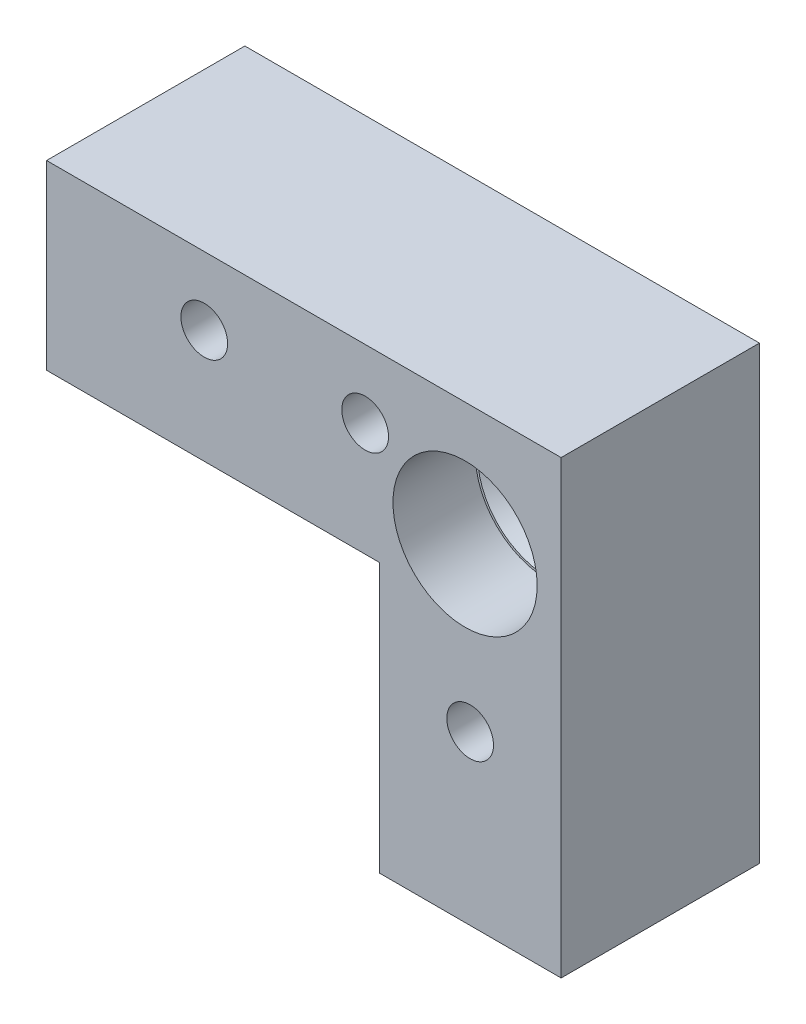
ISO-10303-21;
HEADER;
FILE_DESCRIPTION(('STEP AP214'),'2;1');
FILE_NAME('part.step','',(''),(''),'','','');
FILE_SCHEMA(('AUTOMOTIVE_DESIGN { 1 0 10303 214 1 1 1 1 }'));
ENDSEC;
DATA;
#1=APPLICATION_CONTEXT('core data for automotive mechanical design processes');
#2=APPLICATION_PROTOCOL_DEFINITION('international standard','automotive_design',2000,#1);
#3=PRODUCT_CONTEXT('',#1,'mechanical');
#4=PRODUCT('Part','Part','',(#3));
#5=PRODUCT_RELATED_PRODUCT_CATEGORY('part','',(#4));
#6=PRODUCT_DEFINITION_FORMATION('','',#4);
#7=PRODUCT_DEFINITION_CONTEXT('part definition',#1,'design');
#8=PRODUCT_DEFINITION('design','',#6,#7);
#9=PRODUCT_DEFINITION_SHAPE('','',#8);
#10=(LENGTH_UNIT() NAMED_UNIT(*) SI_UNIT(.MILLI.,.METRE.));
#11=(NAMED_UNIT(*) PLANE_ANGLE_UNIT() SI_UNIT($,.RADIAN.));
#12=(NAMED_UNIT(*) SI_UNIT($,.STERADIAN.) SOLID_ANGLE_UNIT());
#13=UNCERTAINTY_MEASURE_WITH_UNIT(LENGTH_MEASURE(1.E-05),#10,'distance_accuracy_value','');
#14=(GEOMETRIC_REPRESENTATION_CONTEXT(3) GLOBAL_UNCERTAINTY_ASSIGNED_CONTEXT((#13)) GLOBAL_UNIT_ASSIGNED_CONTEXT((#10,
#11,#12)) REPRESENTATION_CONTEXT('',''));
#15=CARTESIAN_POINT('',(0.,0.,0.));
#16=DIRECTION('',(0.,0.,1.));
#17=DIRECTION('',(1.,0.,0.));
#18=AXIS2_PLACEMENT_3D('',#15,#16,#17);
#19=CARTESIAN_POINT('',(-1.10000000000001,-5.25,-10.));
#20=DIRECTION('',(0.,0.,1.));
#21=DIRECTION('',(1.,0.,0.));
#22=AXIS2_PLACEMENT_3D('',#19,#20,#21);
#23=CYLINDRICAL_SURFACE('',#22,1.825);
#24=CARTESIAN_POINT('',(-1.10000000000001,-5.25,0.));
#25=DIRECTION('',(0.,0.,-1.));
#26=DIRECTION('',(-1.,0.,0.));
#27=AXIS2_PLACEMENT_3D('',#24,#25,#26);
#28=CIRCLE('',#27,1.825);
#29=CARTESIAN_POINT('',(-2.92500000000001,-5.25,0.));
#30=VERTEX_POINT('',#29);
#31=EDGE_CURVE('E127',#30,#30,#28,.T.);
#32=ORIENTED_EDGE('',*,*,#31,.F.);
#33=EDGE_LOOP('',(#32));
#34=FACE_BOUND('',#33,.T.);
#35=CARTESIAN_POINT('',(-1.10000000000001,-5.25,-5.));
#36=DIRECTION('',(0.,0.,-1.));
#37=DIRECTION('',(-1.,0.,0.));
#38=AXIS2_PLACEMENT_3D('',#35,#36,#37);
#39=CIRCLE('',#38,1.825);
#40=CARTESIAN_POINT('',(-2.92500000000001,-5.25,-5.));
#41=VERTEX_POINT('',#40);
#42=EDGE_CURVE('E209',#41,#41,#39,.T.);
#43=ORIENTED_EDGE('',*,*,#42,.T.);
#44=EDGE_LOOP('',(#43));
#45=FACE_BOUND('',#44,.T.);
#46=ADVANCED_FACE('F45',(#34,#45),#23,.F.);
#47=CARTESIAN_POINT('',(-13.5,-5.25,-10.));
#48=DIRECTION('',(0.,0.,1.));
#49=DIRECTION('',(1.,0.,0.));
#50=AXIS2_PLACEMENT_3D('',#47,#48,#49);
#51=CYLINDRICAL_SURFACE('',#50,1.825);
#52=CARTESIAN_POINT('',(-13.5,-5.25,0.));
#53=DIRECTION('',(0.,0.,-1.));
#54=DIRECTION('',(-1.,0.,0.));
#55=AXIS2_PLACEMENT_3D('',#52,#53,#54);
#56=CIRCLE('',#55,1.825);
#57=CARTESIAN_POINT('',(-15.325,-5.25,0.));
#58=VERTEX_POINT('',#57);
#59=EDGE_CURVE('E131',#58,#58,#56,.T.);
#60=ORIENTED_EDGE('',*,*,#59,.F.);
#61=EDGE_LOOP('',(#60));
#62=FACE_BOUND('',#61,.T.);
#63=CARTESIAN_POINT('',(-13.5,-5.25,-5.));
#64=DIRECTION('',(0.,0.,-1.));
#65=DIRECTION('',(-1.,0.,0.));
#66=AXIS2_PLACEMENT_3D('',#63,#64,#65);
#67=CIRCLE('',#66,1.825);
#68=CARTESIAN_POINT('',(-15.325,-5.25,-5.));
#69=VERTEX_POINT('',#68);
#70=EDGE_CURVE('E204',#69,#69,#67,.T.);
#71=ORIENTED_EDGE('',*,*,#70,.T.);
#72=EDGE_LOOP('',(#71));
#73=FACE_BOUND('',#72,.T.);
#74=ADVANCED_FACE('F231',(#62,#73),#51,.F.);
#75=CARTESIAN_POINT('',(6.98999999999999,-21.8,-10.));
#76=DIRECTION('',(0.,0.,1.));
#77=DIRECTION('',(1.,0.,0.));
#78=AXIS2_PLACEMENT_3D('',#75,#76,#77);
#79=CYLINDRICAL_SURFACE('',#78,1.825);
#80=CARTESIAN_POINT('',(6.98999999999999,-21.8,0.));
#81=DIRECTION('',(0.,0.,-1.));
#82=DIRECTION('',(-1.,0.,0.));
#83=AXIS2_PLACEMENT_3D('',#80,#81,#82);
#84=CIRCLE('',#83,1.825);
#85=CARTESIAN_POINT('',(5.16499999999999,-21.8,0.));
#86=VERTEX_POINT('',#85);
#87=EDGE_CURVE('E370',#86,#86,#84,.T.);
#88=ORIENTED_EDGE('',*,*,#87,.F.);
#89=EDGE_LOOP('',(#88));
#90=FACE_BOUND('',#89,.T.);
#91=CARTESIAN_POINT('',(6.98999999999999,-21.8,-5.));
#92=DIRECTION('',(0.,0.,-1.));
#93=DIRECTION('',(-1.,0.,0.));
#94=AXIS2_PLACEMENT_3D('',#91,#92,#93);
#95=CIRCLE('',#94,1.825);
#96=CARTESIAN_POINT('',(5.16499999999999,-21.8,-5.));
#97=VERTEX_POINT('',#96);
#98=EDGE_CURVE('E200',#97,#97,#95,.T.);
#99=ORIENTED_EDGE('',*,*,#98,.T.);
#100=EDGE_LOOP('',(#99));
#101=FACE_BOUND('',#100,.T.);
#102=ADVANCED_FACE('F237',(#90,#101),#79,.F.);
#103=CARTESIAN_POINT('',(0.,0.,42.65));
#104=DIRECTION('',(0.,-1.,0.));
#105=DIRECTION('',(1.,0.,0.));
#106=AXIS2_PLACEMENT_3D('',#103,#104,#105);
#107=PLANE('',#106);
#108=DIRECTION('',(0.,0.,-1.));
#109=VECTOR('',#108,1.);
#110=CARTESIAN_POINT('',(-25.65,0.,42.65));
#111=LINE('',#110,#109);
#112=CARTESIAN_POINT('',(-25.65,0.,5.28));
#113=VERTEX_POINT('',#112);
#114=CARTESIAN_POINT('',(-25.65,0.,-10.));
#115=VERTEX_POINT('',#114);
#116=EDGE_CURVE('E99',#113,#115,#111,.T.);
#117=ORIENTED_EDGE('',*,*,#116,.F.);
#118=DIRECTION('',(-1.,0.,0.));
#119=VECTOR('',#118,1.);
#120=CARTESIAN_POINT('',(-36.4186276215853,0.,5.28));
#121=LINE('',#120,#119);
#122=CARTESIAN_POINT('',(14.,0.,5.28));
#123=VERTEX_POINT('',#122);
#124=EDGE_CURVE('E146',#123,#113,#121,.T.);
#125=ORIENTED_EDGE('',*,*,#124,.F.);
#126=DIRECTION('',(0.,0.,-1.));
#127=VECTOR('',#126,1.);
#128=CARTESIAN_POINT('',(14.,0.,42.65));
#129=LINE('',#128,#127);
#130=CARTESIAN_POINT('',(14.,0.,-10.));
#131=VERTEX_POINT('',#130);
#132=EDGE_CURVE('E114',#123,#131,#129,.T.);
#133=ORIENTED_EDGE('',*,*,#132,.T.);
#134=DIRECTION('',(1.,0.,0.));
#135=VECTOR('',#134,1.);
#136=CARTESIAN_POINT('',(-25.65,0.,-10.));
#137=LINE('',#136,#135);
#138=EDGE_CURVE('E111',#115,#131,#137,.T.);
#139=ORIENTED_EDGE('',*,*,#138,.F.);
#140=EDGE_LOOP('',(#117,#125,#133,#139));
#141=FACE_BOUND('',#140,.T.);
#142=ADVANCED_FACE('F112',(#141),#107,.F.);
#143=CARTESIAN_POINT('',(-25.65,0.,42.65));
#144=DIRECTION('',(1.,0.,0.));
#145=DIRECTION('',(0.,1.,0.));
#146=AXIS2_PLACEMENT_3D('',#143,#144,#145);
#147=PLANE('',#146);
#148=DIRECTION('',(0.,0.,-1.));
#149=VECTOR('',#148,1.);
#150=CARTESIAN_POINT('',(-25.65,-14.,42.65));
#151=LINE('',#150,#149);
#152=CARTESIAN_POINT('',(-25.65,-14.,5.28));
#153=VERTEX_POINT('',#152);
#154=CARTESIAN_POINT('',(-25.65,-14.,-10.));
#155=VERTEX_POINT('',#154);
#156=EDGE_CURVE('E108',#153,#155,#151,.T.);
#157=ORIENTED_EDGE('',*,*,#156,.F.);
#158=DIRECTION('',(0.,1.,0.));
#159=VECTOR('',#158,1.);
#160=CARTESIAN_POINT('',(-25.65,0.,5.28));
#161=LINE('',#160,#159);
#162=EDGE_CURVE('E69',#153,#113,#161,.T.);
#163=ORIENTED_EDGE('',*,*,#162,.T.);
#164=ORIENTED_EDGE('',*,*,#116,.T.);
#165=DIRECTION('',(0.,1.,0.));
#166=VECTOR('',#165,1.);
#167=CARTESIAN_POINT('',(-25.65,-14.,-10.));
#168=LINE('',#167,#166);
#169=EDGE_CURVE('E104',#155,#115,#168,.T.);
#170=ORIENTED_EDGE('',*,*,#169,.F.);
#171=EDGE_LOOP('',(#157,#163,#164,#170));
#172=FACE_BOUND('',#171,.T.);
#173=ADVANCED_FACE('F102',(#172),#147,.F.);
#174=CARTESIAN_POINT('',(0.,-14.,42.65));
#175=DIRECTION('',(0.,-1.,0.));
#176=DIRECTION('',(1.,0.,0.));
#177=AXIS2_PLACEMENT_3D('',#174,#175,#176);
#178=PLANE('',#177);
#179=DIRECTION('',(1.,0.,0.));
#180=VECTOR('',#179,1.);
#181=CARTESIAN_POINT('',(0.,-14.,5.28));
#182=LINE('',#181,#180);
#183=CARTESIAN_POINT('',(0.,-14.,5.28));
#184=VERTEX_POINT('',#183);
#185=EDGE_CURVE('E167',#153,#184,#182,.T.);
#186=ORIENTED_EDGE('',*,*,#185,.F.);
#187=ORIENTED_EDGE('',*,*,#156,.T.);
#188=DIRECTION('',(-1.,0.,0.));
#189=VECTOR('',#188,1.);
#190=CARTESIAN_POINT('',(0.,-14.,-10.));
#191=LINE('',#190,#189);
#192=CARTESIAN_POINT('',(0.,-14.,-10.));
#193=VERTEX_POINT('',#192);
#194=EDGE_CURVE('E125',#193,#155,#191,.T.);
#195=ORIENTED_EDGE('',*,*,#194,.F.);
#196=DIRECTION('',(0.,0.,-1.));
#197=VECTOR('',#196,1.);
#198=CARTESIAN_POINT('',(0.,-14.,42.65));
#199=LINE('',#198,#197);
#200=EDGE_CURVE('E192',#184,#193,#199,.T.);
#201=ORIENTED_EDGE('',*,*,#200,.F.);
#202=EDGE_LOOP('',(#186,#187,#195,#201));
#203=FACE_BOUND('',#202,.T.);
#204=ADVANCED_FACE('F286',(#203),#178,.T.);
#205=CARTESIAN_POINT('',(0.,0.,42.65));
#206=DIRECTION('',(1.,0.,0.));
#207=DIRECTION('',(0.,1.,0.));
#208=AXIS2_PLACEMENT_3D('',#205,#206,#207);
#209=PLANE('',#208);
#210=DIRECTION('',(0.,0.,-1.));
#211=VECTOR('',#210,1.);
#212=CARTESIAN_POINT('',(0.,-34.73,42.65));
#213=LINE('',#212,#211);
#214=CARTESIAN_POINT('',(0.,-34.73,5.28));
#215=VERTEX_POINT('',#214);
#216=CARTESIAN_POINT('',(0.,-34.73,-10.));
#217=VERTEX_POINT('',#216);
#218=EDGE_CURVE('E189',#215,#217,#213,.T.);
#219=ORIENTED_EDGE('',*,*,#218,.F.);
#220=DIRECTION('',(0.,1.,0.));
#221=VECTOR('',#220,1.);
#222=CARTESIAN_POINT('',(0.,0.,5.28));
#223=LINE('',#222,#221);
#224=EDGE_CURVE('E163',#215,#184,#223,.T.);
#225=ORIENTED_EDGE('',*,*,#224,.T.);
#226=ORIENTED_EDGE('',*,*,#200,.T.);
#227=DIRECTION('',(0.,1.,0.));
#228=VECTOR('',#227,1.);
#229=CARTESIAN_POINT('',(0.,-34.73,-10.));
#230=LINE('',#229,#228);
#231=EDGE_CURVE('E141',#217,#193,#230,.T.);
#232=ORIENTED_EDGE('',*,*,#231,.F.);
#233=EDGE_LOOP('',(#219,#225,#226,#232));
#234=FACE_BOUND('',#233,.T.);
#235=ADVANCED_FACE('F282',(#234),#209,.F.);
#236=CARTESIAN_POINT('',(0.,-34.73,42.65));
#237=DIRECTION('',(0.,1.,0.));
#238=DIRECTION('',(0.,0.,1.));
#239=AXIS2_PLACEMENT_3D('',#236,#237,#238);
#240=PLANE('',#239);
#241=DIRECTION('',(0.,0.,-1.));
#242=VECTOR('',#241,1.);
#243=CARTESIAN_POINT('',(14.,-34.73,42.65));
#244=LINE('',#243,#242);
#245=CARTESIAN_POINT('',(14.,-34.73,5.28));
#246=VERTEX_POINT('',#245);
#247=CARTESIAN_POINT('',(14.,-34.73,-10.));
#248=VERTEX_POINT('',#247);
#249=EDGE_CURVE('E186',#246,#248,#244,.T.);
#250=ORIENTED_EDGE('',*,*,#249,.F.);
#251=DIRECTION('',(-1.,0.,0.));
#252=VECTOR('',#251,1.);
#253=CARTESIAN_POINT('',(-36.4186276215853,-34.73,5.28));
#254=LINE('',#253,#252);
#255=EDGE_CURVE('E62',#246,#215,#254,.T.);
#256=ORIENTED_EDGE('',*,*,#255,.T.);
#257=ORIENTED_EDGE('',*,*,#218,.T.);
#258=DIRECTION('',(-1.,0.,0.));
#259=VECTOR('',#258,1.);
#260=CARTESIAN_POINT('',(14.,-34.73,-10.));
#261=LINE('',#260,#259);
#262=EDGE_CURVE('E137',#248,#217,#261,.T.);
#263=ORIENTED_EDGE('',*,*,#262,.F.);
#264=EDGE_LOOP('',(#250,#256,#257,#263));
#265=FACE_BOUND('',#264,.T.);
#266=ADVANCED_FACE('F278',(#265),#240,.F.);
#267=CARTESIAN_POINT('',(14.,0.,42.65));
#268=DIRECTION('',(1.,0.,0.));
#269=DIRECTION('',(0.,1.,0.));
#270=AXIS2_PLACEMENT_3D('',#267,#268,#269);
#271=PLANE('',#270);
#272=DIRECTION('',(0.,1.,0.));
#273=VECTOR('',#272,1.);
#274=CARTESIAN_POINT('',(14.,0.,5.28));
#275=LINE('',#274,#273);
#276=EDGE_CURVE('E160',#246,#123,#275,.T.);
#277=ORIENTED_EDGE('',*,*,#276,.F.);
#278=ORIENTED_EDGE('',*,*,#249,.T.);
#279=DIRECTION('',(0.,-1.,0.));
#280=VECTOR('',#279,1.);
#281=CARTESIAN_POINT('',(14.,0.,-10.));
#282=LINE('',#281,#280);
#283=EDGE_CURVE('E119',#131,#248,#282,.T.);
#284=ORIENTED_EDGE('',*,*,#283,.F.);
#285=ORIENTED_EDGE('',*,*,#132,.F.);
#286=EDGE_LOOP('',(#277,#278,#284,#285));
#287=FACE_BOUND('',#286,.T.);
#288=ADVANCED_FACE('F274',(#287),#271,.T.);
#289=CARTESIAN_POINT('',(6.98999999999999,-21.8,0.));
#290=DIRECTION('',(0.,0.,-1.));
#291=DIRECTION('',(-1.,0.,0.));
#292=AXIS2_PLACEMENT_3D('',#289,#290,#291);
#293=CYLINDRICAL_SURFACE('',#292,1.8);
#294=CARTESIAN_POINT('',(6.98999999999999,-21.8,5.28));
#295=DIRECTION('',(0.,0.,-1.));
#296=DIRECTION('',(-1.,0.,0.));
#297=AXIS2_PLACEMENT_3D('',#294,#295,#296);
#298=CIRCLE('',#297,1.8);
#299=CARTESIAN_POINT('',(5.18999999999999,-21.8,5.28));
#300=VERTEX_POINT('',#299);
#301=EDGE_CURVE('E156',#300,#300,#298,.F.);
#302=ORIENTED_EDGE('',*,*,#301,.T.);
#303=EDGE_LOOP('',(#302));
#304=FACE_BOUND('',#303,.T.);
#305=CARTESIAN_POINT('',(6.98999999999999,-21.8,0.0250000000000025));
#306=DIRECTION('',(0.,0.,-1.));
#307=DIRECTION('',(-1.,0.,0.));
#308=AXIS2_PLACEMENT_3D('',#305,#306,#307);
#309=CIRCLE('',#308,1.8);
#310=CARTESIAN_POINT('',(5.18999999999999,-21.8,0.0250000000000025));
#311=VERTEX_POINT('',#310);
#312=EDGE_CURVE('E180',#311,#311,#309,.T.);
#313=ORIENTED_EDGE('',*,*,#312,.T.);
#314=EDGE_LOOP('',(#313));
#315=FACE_BOUND('',#314,.T.);
#316=ADVANCED_FACE('F270',(#304,#315),#293,.F.);
#317=CARTESIAN_POINT('',(6.98999999999999,-21.8,0.));
#318=DIRECTION('',(0.,0.,-1.));
#319=DIRECTION('',(-1.,0.,0.));
#320=AXIS2_PLACEMENT_3D('',#317,#318,#319);
#321=CONICAL_SURFACE('',#320,1.825,0.785398163397414);
#322=ORIENTED_EDGE('',*,*,#312,.F.);
#323=EDGE_LOOP('',(#322));
#324=FACE_BOUND('',#323,.T.);
#325=ORIENTED_EDGE('',*,*,#87,.T.);
#326=EDGE_LOOP('',(#325));
#327=FACE_BOUND('',#326,.T.);
#328=ADVANCED_FACE('F266',(#324,#327),#321,.F.);
#329=CARTESIAN_POINT('',(-13.5,-5.25,0.));
#330=DIRECTION('',(0.,0.,-1.));
#331=DIRECTION('',(-1.,0.,0.));
#332=AXIS2_PLACEMENT_3D('',#329,#330,#331);
#333=CYLINDRICAL_SURFACE('',#332,1.8);
#334=CARTESIAN_POINT('',(-13.5,-5.25,5.28));
#335=DIRECTION('',(0.,0.,-1.));
#336=DIRECTION('',(-1.,0.,0.));
#337=AXIS2_PLACEMENT_3D('',#334,#335,#336);
#338=CIRCLE('',#337,1.8);
#339=CARTESIAN_POINT('',(-15.3,-5.25,5.28));
#340=VERTEX_POINT('',#339);
#341=EDGE_CURVE('E152',#340,#340,#338,.F.);
#342=ORIENTED_EDGE('',*,*,#341,.T.);
#343=EDGE_LOOP('',(#342));
#344=FACE_BOUND('',#343,.T.);
#345=CARTESIAN_POINT('',(-13.5,-5.25,0.0250000000000025));
#346=DIRECTION('',(0.,0.,-1.));
#347=DIRECTION('',(-1.,0.,0.));
#348=AXIS2_PLACEMENT_3D('',#345,#346,#347);
#349=CIRCLE('',#348,1.8);
#350=CARTESIAN_POINT('',(-15.3,-5.25,0.0250000000000025));
#351=VERTEX_POINT('',#350);
#352=EDGE_CURVE('E176',#351,#351,#349,.T.);
#353=ORIENTED_EDGE('',*,*,#352,.T.);
#354=EDGE_LOOP('',(#353));
#355=FACE_BOUND('',#354,.T.);
#356=ADVANCED_FACE('F262',(#344,#355),#333,.F.);
#357=CARTESIAN_POINT('',(-13.5,-5.25,0.));
#358=DIRECTION('',(0.,0.,-1.));
#359=DIRECTION('',(-1.,0.,0.));
#360=AXIS2_PLACEMENT_3D('',#357,#358,#359);
#361=CONICAL_SURFACE('',#360,1.825,0.785398163397414);
#362=ORIENTED_EDGE('',*,*,#352,.F.);
#363=EDGE_LOOP('',(#362));
#364=FACE_BOUND('',#363,.T.);
#365=ORIENTED_EDGE('',*,*,#59,.T.);
#366=EDGE_LOOP('',(#365));
#367=FACE_BOUND('',#366,.T.);
#368=ADVANCED_FACE('F258',(#364,#367),#361,.F.);
#369=CARTESIAN_POINT('',(-1.10000000000001,-5.25,0.));
#370=DIRECTION('',(0.,0.,-1.));
#371=DIRECTION('',(-1.,0.,0.));
#372=AXIS2_PLACEMENT_3D('',#369,#370,#371);
#373=CYLINDRICAL_SURFACE('',#372,1.8);
#374=CARTESIAN_POINT('',(-1.10000000000001,-5.25,5.28));
#375=DIRECTION('',(0.,0.,-1.));
#376=DIRECTION('',(-1.,0.,0.));
#377=AXIS2_PLACEMENT_3D('',#374,#375,#376);
#378=CIRCLE('',#377,1.8);
#379=CARTESIAN_POINT('',(-2.90000000000001,-5.25,5.28));
#380=VERTEX_POINT('',#379);
#381=EDGE_CURVE('E149',#380,#380,#378,.F.);
#382=ORIENTED_EDGE('',*,*,#381,.T.);
#383=EDGE_LOOP('',(#382));
#384=FACE_BOUND('',#383,.T.);
#385=CARTESIAN_POINT('',(-1.10000000000001,-5.25,0.0250000000000025));
#386=DIRECTION('',(0.,0.,-1.));
#387=DIRECTION('',(-1.,0.,0.));
#388=AXIS2_PLACEMENT_3D('',#385,#386,#387);
#389=CIRCLE('',#388,1.8);
#390=CARTESIAN_POINT('',(-2.90000000000001,-5.25,0.0250000000000025));
#391=VERTEX_POINT('',#390);
#392=EDGE_CURVE('E172',#391,#391,#389,.T.);
#393=ORIENTED_EDGE('',*,*,#392,.T.);
#394=EDGE_LOOP('',(#393));
#395=FACE_BOUND('',#394,.T.);
#396=ADVANCED_FACE('F254',(#384,#395),#373,.F.);
#397=CARTESIAN_POINT('',(-1.10000000000001,-5.25,0.));
#398=DIRECTION('',(0.,0.,-1.));
#399=DIRECTION('',(-1.,0.,0.));
#400=AXIS2_PLACEMENT_3D('',#397,#398,#399);
#401=CONICAL_SURFACE('',#400,1.825,0.785398163397422);
#402=ORIENTED_EDGE('',*,*,#392,.F.);
#403=EDGE_LOOP('',(#402));
#404=FACE_BOUND('',#403,.T.);
#405=ORIENTED_EDGE('',*,*,#31,.T.);
#406=EDGE_LOOP('',(#405));
#407=FACE_BOUND('',#406,.T.);
#408=ADVANCED_FACE('F250',(#404,#407),#401,.F.);
#409=CARTESIAN_POINT('',(-36.4186276215853,-34.73,5.28));
#410=DIRECTION('',(0.,0.,-1.));
#411=DIRECTION('',(-1.,0.,0.));
#412=AXIS2_PLACEMENT_3D('',#409,#410,#411);
#413=PLANE('',#412);
#414=CARTESIAN_POINT('',(6.59775286295883,-9.46991187745994,5.28));
#415=DIRECTION('',(0.,0.,1.));
#416=DIRECTION('',(1.,0.,0.));
#417=AXIS2_PLACEMENT_3D('',#414,#415,#416);
#418=CIRCLE('',#417,5.55625);
#419=CARTESIAN_POINT('',(12.1540028629588,-9.46991187745994,5.28));
#420=VERTEX_POINT('',#419);
#421=EDGE_CURVE('E212',#420,#420,#418,.T.);
#422=ORIENTED_EDGE('',*,*,#421,.F.);
#423=EDGE_LOOP('',(#422));
#424=FACE_BOUND('',#423,.T.);
#425=ORIENTED_EDGE('',*,*,#341,.F.);
#426=EDGE_LOOP('',(#425));
#427=FACE_BOUND('',#426,.T.);
#428=ORIENTED_EDGE('',*,*,#381,.F.);
#429=EDGE_LOOP('',(#428));
#430=FACE_BOUND('',#429,.T.);
#431=ORIENTED_EDGE('',*,*,#301,.F.);
#432=EDGE_LOOP('',(#431));
#433=FACE_BOUND('',#432,.T.);
#434=ORIENTED_EDGE('',*,*,#185,.T.);
#435=ORIENTED_EDGE('',*,*,#224,.F.);
#436=ORIENTED_EDGE('',*,*,#255,.F.);
#437=ORIENTED_EDGE('',*,*,#276,.T.);
#438=ORIENTED_EDGE('',*,*,#124,.T.);
#439=ORIENTED_EDGE('',*,*,#162,.F.);
#440=EDGE_LOOP('',(#434,#435,#436,#437,#438,#439));
#441=FACE_BOUND('',#440,.T.);
#442=ADVANCED_FACE('F246',(#424,#427,#430,#433,#441),#413,.F.);
#443=CARTESIAN_POINT('',(0.,0.,-10.));
#444=DIRECTION('',(0.,0.,-1.));
#445=DIRECTION('',(-1.,0.,0.));
#446=AXIS2_PLACEMENT_3D('',#443,#444,#445);
#447=PLANE('',#446);
#448=CARTESIAN_POINT('',(6.98999999999999,-21.8,-10.));
#449=DIRECTION('',(0.,0.,-1.));
#450=DIRECTION('',(-1.,0.,0.));
#451=AXIS2_PLACEMENT_3D('',#448,#449,#450);
#452=CIRCLE('',#451,5.);
#453=CARTESIAN_POINT('',(1.98999999999999,-21.8,-10.));
#454=VERTEX_POINT('',#453);
#455=EDGE_CURVE('E352',#454,#454,#452,.T.);
#456=ORIENTED_EDGE('',*,*,#455,.F.);
#457=EDGE_LOOP('',(#456));
#458=FACE_BOUND('',#457,.T.);
#459=CARTESIAN_POINT('',(-13.5,-5.25,-10.));
#460=DIRECTION('',(0.,0.,-1.));
#461=DIRECTION('',(-1.,0.,0.));
#462=AXIS2_PLACEMENT_3D('',#459,#460,#461);
#463=CIRCLE('',#462,5.);
#464=CARTESIAN_POINT('',(-18.5,-5.25,-10.));
#465=VERTEX_POINT('',#464);
#466=EDGE_CURVE('E339',#465,#465,#463,.T.);
#467=ORIENTED_EDGE('',*,*,#466,.F.);
#468=EDGE_LOOP('',(#467));
#469=FACE_BOUND('',#468,.T.);
#470=CARTESIAN_POINT('',(-1.10000000000001,-5.25,-10.));
#471=DIRECTION('',(0.,0.,-1.));
#472=DIRECTION('',(-1.,0.,0.));
#473=AXIS2_PLACEMENT_3D('',#470,#471,#472);
#474=CIRCLE('',#473,5.);
#475=CARTESIAN_POINT('',(-6.10000000000001,-5.25,-10.));
#476=VERTEX_POINT('',#475);
#477=EDGE_CURVE('E338',#476,#476,#474,.T.);
#478=ORIENTED_EDGE('',*,*,#477,.F.);
#479=EDGE_LOOP('',(#478));
#480=FACE_BOUND('',#479,.T.);
#481=CARTESIAN_POINT('',(6.59775286295883,-9.46991187745994,-10.));
#482=DIRECTION('',(0.,0.,1.));
#483=DIRECTION('',(1.,0.,0.));
#484=AXIS2_PLACEMENT_3D('',#481,#482,#483);
#485=CIRCLE('',#484,3.3782);
#486=CARTESIAN_POINT('',(9.97595286295882,-9.46991187745994,-10.));
#487=VERTEX_POINT('',#486);
#488=EDGE_CURVE('E366',#487,#487,#485,.T.);
#489=ORIENTED_EDGE('',*,*,#488,.T.);
#490=EDGE_LOOP('',(#489));
#491=FACE_BOUND('',#490,.T.);
#492=ORIENTED_EDGE('',*,*,#169,.T.);
#493=ORIENTED_EDGE('',*,*,#138,.T.);
#494=ORIENTED_EDGE('',*,*,#283,.T.);
#495=ORIENTED_EDGE('',*,*,#262,.T.);
#496=ORIENTED_EDGE('',*,*,#231,.T.);
#497=ORIENTED_EDGE('',*,*,#194,.T.);
#498=EDGE_LOOP('',(#492,#493,#494,#495,#496,#497));
#499=FACE_BOUND('',#498,.T.);
#500=ADVANCED_FACE('F122',(#458,#469,#480,#491,#499),#447,.T.);
#501=CARTESIAN_POINT('',(6.59775286295883,-9.46991187745994,5.28));
#502=DIRECTION('',(0.,0.,1.));
#503=DIRECTION('',(1.,0.,0.));
#504=AXIS2_PLACEMENT_3D('',#501,#502,#503);
#505=CYLINDRICAL_SURFACE('',#504,3.3782);
#506=CARTESIAN_POINT('',(6.59775286295883,-9.46991187745994,-3.07000000000001));
#507=DIRECTION('',(0.,0.,-1.));
#508=DIRECTION('',(-1.,0.,0.));
#509=AXIS2_PLACEMENT_3D('',#506,#507,#508);
#510=CIRCLE('',#509,3.3782);
#511=CARTESIAN_POINT('',(3.21955286295883,-9.46991187745994,-3.07000000000001));
#512=VERTEX_POINT('',#511);
#513=EDGE_CURVE('E55',#512,#512,#510,.F.);
#514=ORIENTED_EDGE('',*,*,#513,.T.);
#515=EDGE_LOOP('',(#514));
#516=FACE_BOUND('',#515,.T.);
#517=ORIENTED_EDGE('',*,*,#488,.F.);
#518=EDGE_LOOP('',(#517));
#519=FACE_BOUND('',#518,.T.);
#520=ADVANCED_FACE('F217',(#516,#519),#505,.F.);
#521=CARTESIAN_POINT('',(9.97595286295883,-9.46991187745994,-1.07));
#522=DIRECTION('',(0.,0.,-1.));
#523=DIRECTION('',(-1.,0.,0.));
#524=AXIS2_PLACEMENT_3D('',#521,#522,#523);
#525=PLANE('',#524);
#526=CARTESIAN_POINT('',(6.59775286295883,-9.46991187745994,-1.07));
#527=DIRECTION('',(0.,0.,-1.));
#528=DIRECTION('',(-1.,0.,0.));
#529=AXIS2_PLACEMENT_3D('',#526,#527,#528);
#530=CIRCLE('',#529,5.37820000000001);
#531=CARTESIAN_POINT('',(1.21955286295881,-9.46991187745994,-1.07));
#532=VERTEX_POINT('',#531);
#533=EDGE_CURVE('E11',#532,#532,#530,.T.);
#534=ORIENTED_EDGE('',*,*,#533,.T.);
#535=EDGE_LOOP('',(#534));
#536=FACE_BOUND('',#535,.T.);
#537=CARTESIAN_POINT('',(6.59775286295883,-9.46991187745994,-1.07));
#538=DIRECTION('',(0.,0.,1.));
#539=DIRECTION('',(1.,0.,0.));
#540=AXIS2_PLACEMENT_3D('',#537,#538,#539);
#541=CIRCLE('',#540,5.55625);
#542=CARTESIAN_POINT('',(12.1540028629588,-9.46991187745994,-1.07));
#543=VERTEX_POINT('',#542);
#544=EDGE_CURVE('E362',#543,#543,#541,.T.);
#545=ORIENTED_EDGE('',*,*,#544,.T.);
#546=EDGE_LOOP('',(#545));
#547=FACE_BOUND('',#546,.T.);
#548=ADVANCED_FACE('F304',(#536,#547),#525,.F.);
#549=CARTESIAN_POINT('',(6.59775286295883,-9.46991187745994,5.28));
#550=DIRECTION('',(0.,0.,1.));
#551=DIRECTION('',(1.,0.,0.));
#552=AXIS2_PLACEMENT_3D('',#549,#550,#551);
#553=CYLINDRICAL_SURFACE('',#552,5.55625);
#554=ORIENTED_EDGE('',*,*,#544,.F.);
#555=EDGE_LOOP('',(#554));
#556=FACE_BOUND('',#555,.T.);
#557=ORIENTED_EDGE('',*,*,#421,.T.);
#558=EDGE_LOOP('',(#557));
#559=FACE_BOUND('',#558,.T.);
#560=ADVANCED_FACE('F307',(#556,#559),#553,.F.);
#561=CARTESIAN_POINT('',(6.98999999999999,-21.8,-5.));
#562=DIRECTION('',(0.,0.,-1.));
#563=DIRECTION('',(-1.,0.,0.));
#564=AXIS2_PLACEMENT_3D('',#561,#562,#563);
#565=CYLINDRICAL_SURFACE('',#564,5.);
#566=CARTESIAN_POINT('',(6.98999999999999,-21.8,-5.));
#567=DIRECTION('',(0.,0.,-1.));
#568=DIRECTION('',(-1.,0.,0.));
#569=AXIS2_PLACEMENT_3D('',#566,#567,#568);
#570=CIRCLE('',#569,5.);
#571=CARTESIAN_POINT('',(1.98999999999999,-21.8,-5.));
#572=VERTEX_POINT('',#571);
#573=EDGE_CURVE('E346',#572,#572,#570,.T.);
#574=ORIENTED_EDGE('',*,*,#573,.F.);
#575=EDGE_LOOP('',(#574));
#576=FACE_BOUND('',#575,.T.);
#577=ORIENTED_EDGE('',*,*,#455,.T.);
#578=EDGE_LOOP('',(#577));
#579=FACE_BOUND('',#578,.T.);
#580=ADVANCED_FACE('F311',(#576,#579),#565,.F.);
#581=CARTESIAN_POINT('',(6.98999999999999,-21.8,-5.));
#582=DIRECTION('',(0.,0.,-1.));
#583=DIRECTION('',(-1.,0.,0.));
#584=AXIS2_PLACEMENT_3D('',#581,#582,#583);
#585=PLANE('',#584);
#586=ORIENTED_EDGE('',*,*,#98,.F.);
#587=EDGE_LOOP('',(#586));
#588=FACE_BOUND('',#587,.T.);
#589=ORIENTED_EDGE('',*,*,#573,.T.);
#590=EDGE_LOOP('',(#589));
#591=FACE_BOUND('',#590,.T.);
#592=ADVANCED_FACE('F319',(#588,#591),#585,.T.);
#593=CARTESIAN_POINT('',(-13.5,-5.25,-5.));
#594=DIRECTION('',(0.,0.,-1.));
#595=DIRECTION('',(-1.,0.,0.));
#596=AXIS2_PLACEMENT_3D('',#593,#594,#595);
#597=CYLINDRICAL_SURFACE('',#596,5.);
#598=CARTESIAN_POINT('',(-13.5,-5.25,-5.));
#599=DIRECTION('',(0.,0.,-1.));
#600=DIRECTION('',(-1.,0.,0.));
#601=AXIS2_PLACEMENT_3D('',#598,#599,#600);
#602=CIRCLE('',#601,5.);
#603=CARTESIAN_POINT('',(-18.5,-5.25,-5.));
#604=VERTEX_POINT('',#603);
#605=EDGE_CURVE('E336',#604,#604,#602,.T.);
#606=ORIENTED_EDGE('',*,*,#605,.F.);
#607=EDGE_LOOP('',(#606));
#608=FACE_BOUND('',#607,.T.);
#609=ORIENTED_EDGE('',*,*,#466,.T.);
#610=EDGE_LOOP('',(#609));
#611=FACE_BOUND('',#610,.T.);
#612=ADVANCED_FACE('F323',(#608,#611),#597,.F.);
#613=CARTESIAN_POINT('',(-13.5,-5.25,-5.));
#614=DIRECTION('',(0.,0.,-1.));
#615=DIRECTION('',(-1.,0.,0.));
#616=AXIS2_PLACEMENT_3D('',#613,#614,#615);
#617=PLANE('',#616);
#618=ORIENTED_EDGE('',*,*,#70,.F.);
#619=EDGE_LOOP('',(#618));
#620=FACE_BOUND('',#619,.T.);
#621=ORIENTED_EDGE('',*,*,#605,.T.);
#622=EDGE_LOOP('',(#621));
#623=FACE_BOUND('',#622,.T.);
#624=ADVANCED_FACE('F314',(#620,#623),#617,.T.);
#625=CARTESIAN_POINT('',(-1.10000000000001,-5.25,-5.));
#626=DIRECTION('',(0.,0.,-1.));
#627=DIRECTION('',(-1.,0.,0.));
#628=AXIS2_PLACEMENT_3D('',#625,#626,#627);
#629=CYLINDRICAL_SURFACE('',#628,5.);
#630=CARTESIAN_POINT('',(-1.10000000000001,-5.25,-5.));
#631=DIRECTION('',(0.,0.,-1.));
#632=DIRECTION('',(-1.,0.,0.));
#633=AXIS2_PLACEMENT_3D('',#630,#631,#632);
#634=CIRCLE('',#633,5.);
#635=CARTESIAN_POINT('',(-6.10000000000001,-5.25,-5.));
#636=VERTEX_POINT('',#635);
#637=EDGE_CURVE('E205',#636,#636,#634,.T.);
#638=ORIENTED_EDGE('',*,*,#637,.F.);
#639=EDGE_LOOP('',(#638));
#640=FACE_BOUND('',#639,.T.);
#641=ORIENTED_EDGE('',*,*,#477,.T.);
#642=EDGE_LOOP('',(#641));
#643=FACE_BOUND('',#642,.T.);
#644=ADVANCED_FACE('F226',(#640,#643),#629,.F.);
#645=CARTESIAN_POINT('',(-1.10000000000001,-5.25,-5.));
#646=DIRECTION('',(0.,0.,-1.));
#647=DIRECTION('',(-1.,0.,0.));
#648=AXIS2_PLACEMENT_3D('',#645,#646,#647);
#649=PLANE('',#648);
#650=ORIENTED_EDGE('',*,*,#42,.F.);
#651=EDGE_LOOP('',(#650));
#652=FACE_BOUND('',#651,.T.);
#653=ORIENTED_EDGE('',*,*,#637,.T.);
#654=EDGE_LOOP('',(#653));
#655=FACE_BOUND('',#654,.T.);
#656=ADVANCED_FACE('F221',(#652,#655),#649,.T.);
#657=CARTESIAN_POINT('',(6.59775286295883,-9.46991187745994,-3.07000000000001));
#658=DIRECTION('',(0.,0.,1.));
#659=DIRECTION('',(1.,0.,0.));
#660=AXIS2_PLACEMENT_3D('',#657,#658,#659);
#661=CONICAL_SURFACE('',#660,3.3782,0.78539816339745);
#662=ORIENTED_EDGE('',*,*,#533,.F.);
#663=EDGE_LOOP('',(#662));
#664=FACE_BOUND('',#663,.T.);
#665=ORIENTED_EDGE('',*,*,#513,.F.);
#666=EDGE_LOOP('',(#665));
#667=FACE_BOUND('',#666,.T.);
#668=ADVANCED_FACE('F48',(#664,#667),#661,.F.);
#669=CLOSED_SHELL('',(#46,#74,#102,#142,#173,#204,#235,#266,#288,#316,#328,#356,#368,#396,#408,
#442,#500,#520,#548,#560,#580,#592,#612,#624,#644,#656,#668));
#670=MANIFOLD_SOLID_BREP('B2',#669);
#671=ADVANCED_BREP_SHAPE_REPRESENTATION('',(#18,#670),#14);
#672=SHAPE_DEFINITION_REPRESENTATION(#9,#671);
ENDSEC;
END-ISO-10303-21;
